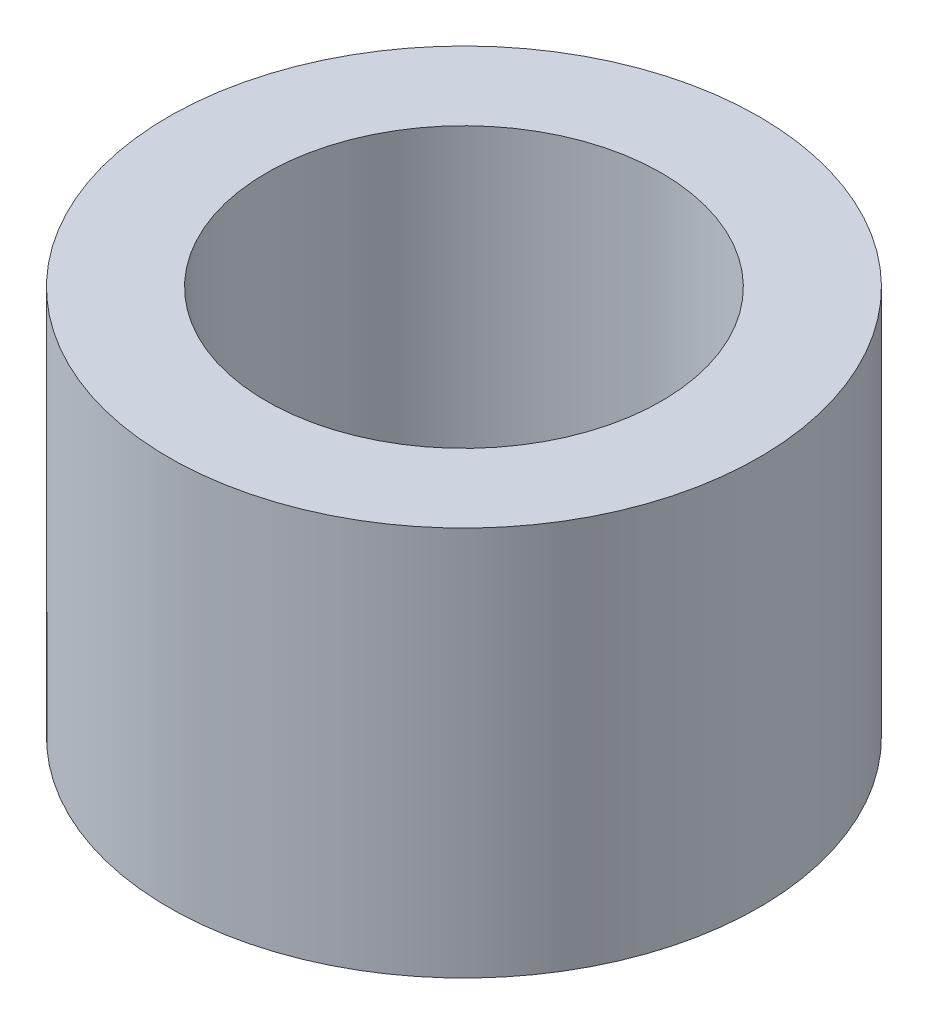
ISO-10303-21;
HEADER;
FILE_DESCRIPTION(('STEP AP214'),'2;1');
FILE_NAME('part.step','',(''),(''),'','','');
FILE_SCHEMA(('AUTOMOTIVE_DESIGN { 1 0 10303 214 1 1 1 1 }'));
ENDSEC;
DATA;
#1=APPLICATION_CONTEXT('core data for automotive mechanical design processes');
#2=APPLICATION_PROTOCOL_DEFINITION('international standard','automotive_design',2000,#1);
#3=PRODUCT_CONTEXT('',#1,'mechanical');
#4=PRODUCT('Part','Part','',(#3));
#5=PRODUCT_RELATED_PRODUCT_CATEGORY('part','',(#4));
#6=PRODUCT_DEFINITION_FORMATION('','',#4);
#7=PRODUCT_DEFINITION_CONTEXT('part definition',#1,'design');
#8=PRODUCT_DEFINITION('design','',#6,#7);
#9=PRODUCT_DEFINITION_SHAPE('','',#8);
#10=(LENGTH_UNIT() NAMED_UNIT(*) SI_UNIT(.MILLI.,.METRE.));
#11=(NAMED_UNIT(*) PLANE_ANGLE_UNIT() SI_UNIT($,.RADIAN.));
#12=(NAMED_UNIT(*) SI_UNIT($,.STERADIAN.) SOLID_ANGLE_UNIT());
#13=UNCERTAINTY_MEASURE_WITH_UNIT(LENGTH_MEASURE(1.E-05),#10,'distance_accuracy_value','');
#14=(GEOMETRIC_REPRESENTATION_CONTEXT(3) GLOBAL_UNCERTAINTY_ASSIGNED_CONTEXT((#13)) GLOBAL_UNIT_ASSIGNED_CONTEXT((#10,
#11,#12)) REPRESENTATION_CONTEXT('',''));
#15=CARTESIAN_POINT('',(0.,0.,0.));
#16=DIRECTION('',(0.,0.,1.));
#17=DIRECTION('',(1.,0.,0.));
#18=AXIS2_PLACEMENT_3D('',#15,#16,#17);
#19=CARTESIAN_POINT('',(0.,8.382,0.));
#20=DIRECTION('',(0.,1.,0.));
#21=DIRECTION('',(0.,0.,1.));
#22=AXIS2_PLACEMENT_3D('',#19,#20,#21);
#23=PLANE('',#22);
#24=CARTESIAN_POINT('',(0.,8.382,0.));
#25=DIRECTION('',(0.,1.,0.));
#26=DIRECTION('',(0.,0.,1.));
#27=AXIS2_PLACEMENT_3D('',#24,#25,#26);
#28=CIRCLE('',#27,6.35);
#29=CARTESIAN_POINT('',(0.,8.382,-6.35));
#30=VERTEX_POINT('',#29);
#31=EDGE_CURVE('E10',#30,#30,#28,.T.);
#32=ORIENTED_EDGE('',*,*,#31,.T.);
#33=EDGE_LOOP('',(#32));
#34=FACE_BOUND('',#33,.T.);
#35=CARTESIAN_POINT('',(0.,8.382,0.));
#36=DIRECTION('',(0.,1.,0.));
#37=DIRECTION('',(0.,0.,1.));
#38=AXIS2_PLACEMENT_3D('',#35,#36,#37);
#39=CIRCLE('',#38,4.25);
#40=CARTESIAN_POINT('',(0.,8.382,-4.25));
#41=VERTEX_POINT('',#40);
#42=EDGE_CURVE('E46',#41,#41,#39,.T.);
#43=ORIENTED_EDGE('',*,*,#42,.F.);
#44=EDGE_LOOP('',(#43));
#45=FACE_BOUND('',#44,.T.);
#46=ADVANCED_FACE('F35',(#34,#45),#23,.T.);
#47=CARTESIAN_POINT('',(0.,0.,0.));
#48=DIRECTION('',(0.,1.,0.));
#49=DIRECTION('',(0.,0.,1.));
#50=AXIS2_PLACEMENT_3D('',#47,#48,#49);
#51=PLANE('',#50);
#52=CARTESIAN_POINT('',(0.,0.,0.));
#53=DIRECTION('',(0.,1.,0.));
#54=DIRECTION('',(0.,0.,1.));
#55=AXIS2_PLACEMENT_3D('',#52,#53,#54);
#56=CIRCLE('',#55,6.35);
#57=CARTESIAN_POINT('',(0.,0.,-6.35));
#58=VERTEX_POINT('',#57);
#59=EDGE_CURVE('E39',#58,#58,#56,.T.);
#60=ORIENTED_EDGE('',*,*,#59,.F.);
#61=EDGE_LOOP('',(#60));
#62=FACE_BOUND('',#61,.T.);
#63=CARTESIAN_POINT('',(0.,0.,0.));
#64=DIRECTION('',(0.,1.,0.));
#65=DIRECTION('',(0.,0.,1.));
#66=AXIS2_PLACEMENT_3D('',#63,#64,#65);
#67=CIRCLE('',#66,4.25);
#68=CARTESIAN_POINT('',(0.,0.,-4.25));
#69=VERTEX_POINT('',#68);
#70=EDGE_CURVE('E48',#69,#69,#67,.T.);
#71=ORIENTED_EDGE('',*,*,#70,.T.);
#72=EDGE_LOOP('',(#71));
#73=FACE_BOUND('',#72,.T.);
#74=ADVANCED_FACE('F58',(#62,#73),#51,.F.);
#75=CARTESIAN_POINT('',(0.,8.382,0.));
#76=DIRECTION('',(0.,-1.,0.));
#77=DIRECTION('',(0.,0.,-1.));
#78=AXIS2_PLACEMENT_3D('',#75,#76,#77);
#79=CYLINDRICAL_SURFACE('',#78,6.35);
#80=CARTESIAN_POINT('',(0.,8.382,-6.35));
#81=CARTESIAN_POINT('',(0.,8.2946875,-6.35));
#82=CARTESIAN_POINT('',(0.,8.207375,-6.35));
#83=CARTESIAN_POINT('',(0.,8.03275,-6.35));
#84=CARTESIAN_POINT('',(0.,7.9454375,-6.35));
#85=CARTESIAN_POINT('',(0.,7.7708125,-6.35));
#86=CARTESIAN_POINT('',(0.,7.6835,-6.35));
#87=CARTESIAN_POINT('',(0.,7.508875,-6.35));
#88=CARTESIAN_POINT('',(0.,7.4215625,-6.35));
#89=CARTESIAN_POINT('',(0.,7.2469375,-6.35));
#90=CARTESIAN_POINT('',(0.,7.159625,-6.35));
#91=CARTESIAN_POINT('',(0.,6.985,-6.35));
#92=CARTESIAN_POINT('',(0.,6.8976875,-6.35));
#93=CARTESIAN_POINT('',(0.,6.7230625,-6.35));
#94=CARTESIAN_POINT('',(0.,6.63575,-6.35));
#95=CARTESIAN_POINT('',(0.,6.461125,-6.35));
#96=CARTESIAN_POINT('',(0.,6.3738125,-6.35));
#97=CARTESIAN_POINT('',(0.,6.1991875,-6.35));
#98=CARTESIAN_POINT('',(0.,6.111875,-6.35));
#99=CARTESIAN_POINT('',(0.,5.93725,-6.35));
#100=CARTESIAN_POINT('',(0.,5.8499375,-6.35));
#101=CARTESIAN_POINT('',(0.,5.6753125,-6.35));
#102=CARTESIAN_POINT('',(0.,5.588,-6.35));
#103=CARTESIAN_POINT('',(0.,5.413375,-6.35));
#104=CARTESIAN_POINT('',(0.,5.3260625,-6.35));
#105=CARTESIAN_POINT('',(0.,5.1514375,-6.35));
#106=CARTESIAN_POINT('',(0.,5.064125,-6.35));
#107=CARTESIAN_POINT('',(0.,4.8895,-6.35));
#108=CARTESIAN_POINT('',(0.,4.8021875,-6.35));
#109=CARTESIAN_POINT('',(0.,4.6275625,-6.35));
#110=CARTESIAN_POINT('',(0.,4.54025,-6.35));
#111=CARTESIAN_POINT('',(0.,4.365625,-6.35));
#112=CARTESIAN_POINT('',(0.,4.2783125,-6.35));
#113=CARTESIAN_POINT('',(0.,4.1036875,-6.35));
#114=CARTESIAN_POINT('',(0.,4.016375,-6.35));
#115=CARTESIAN_POINT('',(0.,3.84175,-6.35));
#116=CARTESIAN_POINT('',(0.,3.7544375,-6.35));
#117=CARTESIAN_POINT('',(0.,3.5798125,-6.35));
#118=CARTESIAN_POINT('',(0.,3.4925,-6.35));
#119=CARTESIAN_POINT('',(0.,3.317875,-6.35));
#120=CARTESIAN_POINT('',(0.,3.2305625,-6.35));
#121=CARTESIAN_POINT('',(0.,3.0559375,-6.35));
#122=CARTESIAN_POINT('',(0.,2.968625,-6.35));
#123=CARTESIAN_POINT('',(0.,2.794,-6.35));
#124=CARTESIAN_POINT('',(0.,2.7066875,-6.35));
#125=CARTESIAN_POINT('',(0.,2.5320625,-6.35));
#126=CARTESIAN_POINT('',(0.,2.44475,-6.35));
#127=CARTESIAN_POINT('',(0.,2.270125,-6.35));
#128=CARTESIAN_POINT('',(0.,2.1828125,-6.35));
#129=CARTESIAN_POINT('',(0.,2.0081875,-6.35));
#130=CARTESIAN_POINT('',(0.,1.920875,-6.35));
#131=CARTESIAN_POINT('',(0.,1.74625,-6.35));
#132=CARTESIAN_POINT('',(0.,1.6589375,-6.35));
#133=CARTESIAN_POINT('',(0.,1.4843125,-6.35));
#134=CARTESIAN_POINT('',(0.,1.397,-6.35));
#135=CARTESIAN_POINT('',(0.,1.222375,-6.35));
#136=CARTESIAN_POINT('',(0.,1.1350625,-6.35));
#137=CARTESIAN_POINT('',(0.,0.9604375,-6.35));
#138=CARTESIAN_POINT('',(0.,0.873125,-6.35));
#139=CARTESIAN_POINT('',(0.,0.6985,-6.35));
#140=CARTESIAN_POINT('',(0.,0.6111875,-6.35));
#141=CARTESIAN_POINT('',(0.,0.4365625,-6.35));
#142=CARTESIAN_POINT('',(0.,0.34925,-6.35));
#143=CARTESIAN_POINT('',(0.,0.174625,-6.35));
#144=CARTESIAN_POINT('',(0.,0.0873125,-6.35));
#145=CARTESIAN_POINT('',(0.,0.,-6.35));
#146=B_SPLINE_CURVE_WITH_KNOTS('',3,(#80,#81,#82,#83,#84,#85,#86,#87,#88,#89,#90,#91,#92,#93,
#94,#95,#96,#97,#98,#99,#100,#101,#102,#103,#104,#105,#106,#107,#108,#109,#110,#111,#112,#113,
#114,#115,#116,#117,#118,#119,#120,#121,#122,#123,#124,#125,#126,#127,#128,#129,#130,#131,#132,
#133,#134,#135,#136,#137,#138,#139,#140,#141,#142,#143,#144,#145),.UNSPECIFIED.,.F.,.F.,(4,2,2,
2,2,2,2,2,2,2,2,2,2,2,2,2,2,2,2,2,2,2,2,2,2,2,2,2,2,2,2,2,4),(0.,0.261937499999998,
0.523874999999998,0.785812499999999,1.04775,1.3096875,1.571625,1.8335625,2.0955,2.3574375,
2.619375,2.8813125,3.14325,3.4051875,3.667125,3.9290625,4.191,4.4529375,4.714875,4.9768125,
5.23875,5.5006875,5.762625,6.0245625,6.2865,6.5484375,6.810375,7.0723125,7.33425,7.5961875,
7.858125,8.1200625,8.382),.UNSPECIFIED.);
#147=EDGE_CURVE('BSEAM37',#30,#58,#146,.T.);
#148=ORIENTED_EDGE('',*,*,#31,.F.);
#149=ORIENTED_EDGE('',*,*,#59,.T.);
#150=ORIENTED_EDGE('',*,*,#147,.T.);
#151=ORIENTED_EDGE('',*,*,#147,.F.);
#152=EDGE_LOOP('',(#148,#150,#149,#151));
#153=FACE_BOUND('',#152,.T.);
#154=ADVANCED_FACE('F37',(#153),#79,.T.);
#155=CARTESIAN_POINT('',(0.,8.382,0.));
#156=DIRECTION('',(0.,-1.,0.));
#157=DIRECTION('',(0.,0.,-1.));
#158=AXIS2_PLACEMENT_3D('',#155,#156,#157);
#159=CYLINDRICAL_SURFACE('',#158,4.25);
#160=CARTESIAN_POINT('',(0.,8.382,-4.25));
#161=CARTESIAN_POINT('',(0.,8.2946875,-4.25));
#162=CARTESIAN_POINT('',(0.,8.207375,-4.25));
#163=CARTESIAN_POINT('',(0.,8.03275,-4.25));
#164=CARTESIAN_POINT('',(0.,7.9454375,-4.25));
#165=CARTESIAN_POINT('',(0.,7.7708125,-4.25));
#166=CARTESIAN_POINT('',(0.,7.6835,-4.25));
#167=CARTESIAN_POINT('',(0.,7.508875,-4.25));
#168=CARTESIAN_POINT('',(0.,7.4215625,-4.25));
#169=CARTESIAN_POINT('',(0.,7.2469375,-4.25));
#170=CARTESIAN_POINT('',(0.,7.159625,-4.25));
#171=CARTESIAN_POINT('',(0.,6.985,-4.25));
#172=CARTESIAN_POINT('',(0.,6.8976875,-4.25));
#173=CARTESIAN_POINT('',(0.,6.7230625,-4.25));
#174=CARTESIAN_POINT('',(0.,6.63575,-4.25));
#175=CARTESIAN_POINT('',(0.,6.461125,-4.25));
#176=CARTESIAN_POINT('',(0.,6.3738125,-4.25));
#177=CARTESIAN_POINT('',(0.,6.1991875,-4.25));
#178=CARTESIAN_POINT('',(0.,6.111875,-4.25));
#179=CARTESIAN_POINT('',(0.,5.93725,-4.25));
#180=CARTESIAN_POINT('',(0.,5.8499375,-4.25));
#181=CARTESIAN_POINT('',(0.,5.6753125,-4.25));
#182=CARTESIAN_POINT('',(0.,5.588,-4.25));
#183=CARTESIAN_POINT('',(0.,5.413375,-4.25));
#184=CARTESIAN_POINT('',(0.,5.3260625,-4.25));
#185=CARTESIAN_POINT('',(0.,5.1514375,-4.25));
#186=CARTESIAN_POINT('',(0.,5.064125,-4.25));
#187=CARTESIAN_POINT('',(0.,4.8895,-4.25));
#188=CARTESIAN_POINT('',(0.,4.8021875,-4.25));
#189=CARTESIAN_POINT('',(0.,4.6275625,-4.25));
#190=CARTESIAN_POINT('',(0.,4.54025,-4.25));
#191=CARTESIAN_POINT('',(0.,4.365625,-4.25));
#192=CARTESIAN_POINT('',(0.,4.2783125,-4.25));
#193=CARTESIAN_POINT('',(0.,4.1036875,-4.25));
#194=CARTESIAN_POINT('',(0.,4.016375,-4.25));
#195=CARTESIAN_POINT('',(0.,3.84175,-4.25));
#196=CARTESIAN_POINT('',(0.,3.7544375,-4.25));
#197=CARTESIAN_POINT('',(0.,3.5798125,-4.25));
#198=CARTESIAN_POINT('',(0.,3.4925,-4.25));
#199=CARTESIAN_POINT('',(0.,3.317875,-4.25));
#200=CARTESIAN_POINT('',(0.,3.2305625,-4.25));
#201=CARTESIAN_POINT('',(0.,3.0559375,-4.25));
#202=CARTESIAN_POINT('',(0.,2.968625,-4.25));
#203=CARTESIAN_POINT('',(0.,2.794,-4.25));
#204=CARTESIAN_POINT('',(0.,2.7066875,-4.25));
#205=CARTESIAN_POINT('',(0.,2.5320625,-4.25));
#206=CARTESIAN_POINT('',(0.,2.44475,-4.25));
#207=CARTESIAN_POINT('',(0.,2.270125,-4.25));
#208=CARTESIAN_POINT('',(0.,2.1828125,-4.25));
#209=CARTESIAN_POINT('',(0.,2.0081875,-4.25));
#210=CARTESIAN_POINT('',(0.,1.920875,-4.25));
#211=CARTESIAN_POINT('',(0.,1.74625,-4.25));
#212=CARTESIAN_POINT('',(0.,1.6589375,-4.25));
#213=CARTESIAN_POINT('',(0.,1.4843125,-4.25));
#214=CARTESIAN_POINT('',(0.,1.397,-4.25));
#215=CARTESIAN_POINT('',(0.,1.222375,-4.25));
#216=CARTESIAN_POINT('',(0.,1.1350625,-4.25));
#217=CARTESIAN_POINT('',(0.,0.960437499999998,-4.25));
#218=CARTESIAN_POINT('',(0.,0.873124999999998,-4.25));
#219=CARTESIAN_POINT('',(0.,0.698499999999999,-4.25));
#220=CARTESIAN_POINT('',(0.,0.611187499999999,-4.25));
#221=CARTESIAN_POINT('',(0.,0.4365625,-4.25));
#222=CARTESIAN_POINT('',(0.,0.34925,-4.25));
#223=CARTESIAN_POINT('',(0.,0.174625,-4.25));
#224=CARTESIAN_POINT('',(0.,0.0873125,-4.25));
#225=CARTESIAN_POINT('',(0.,0.,-4.25));
#226=B_SPLINE_CURVE_WITH_KNOTS('',3,(#160,#161,#162,#163,#164,#165,#166,#167,#168,#169,#170,
#171,#172,#173,#174,#175,#176,#177,#178,#179,#180,#181,#182,#183,#184,#185,#186,#187,#188,#189,
#190,#191,#192,#193,#194,#195,#196,#197,#198,#199,#200,#201,#202,#203,#204,#205,#206,#207,#208,
#209,#210,#211,#212,#213,#214,#215,#216,#217,#218,#219,#220,#221,#222,#223,#224,#225),
.UNSPECIFIED.,.F.,.F.,(4,2,2,2,2,2,2,2,2,2,2,2,2,2,2,2,2,2,2,2,2,2,2,2,2,2,2,2,2,2,2,2,4),(0.,
0.2619375,0.523875,0.785812500000001,1.04775,1.3096875,1.571625,1.8335625,2.0955,2.3574375,
2.619375,2.8813125,3.14325,3.4051875,3.667125,3.9290625,4.191,4.4529375,4.714875,4.9768125,
5.23875,5.5006875,5.762625,6.0245625,6.2865,6.5484375,6.810375,7.0723125,7.33425,7.5961875,
7.858125,8.1200625,8.382),.UNSPECIFIED.);
#227=EDGE_CURVE('BSEAM54',#41,#69,#226,.T.);
#228=ORIENTED_EDGE('',*,*,#42,.T.);
#229=ORIENTED_EDGE('',*,*,#70,.F.);
#230=ORIENTED_EDGE('',*,*,#227,.T.);
#231=ORIENTED_EDGE('',*,*,#227,.F.);
#232=EDGE_LOOP('',(#228,#230,#229,#231));
#233=FACE_BOUND('',#232,.T.);
#234=ADVANCED_FACE('F54',(#233),#159,.F.);
#235=CLOSED_SHELL('',(#46,#74,#154,#234));
#236=MANIFOLD_SOLID_BREP('B2',#235);
#237=ADVANCED_BREP_SHAPE_REPRESENTATION('',(#18,#236),#14);
#238=SHAPE_DEFINITION_REPRESENTATION(#9,#237);
ENDSEC;
END-ISO-10303-21;
